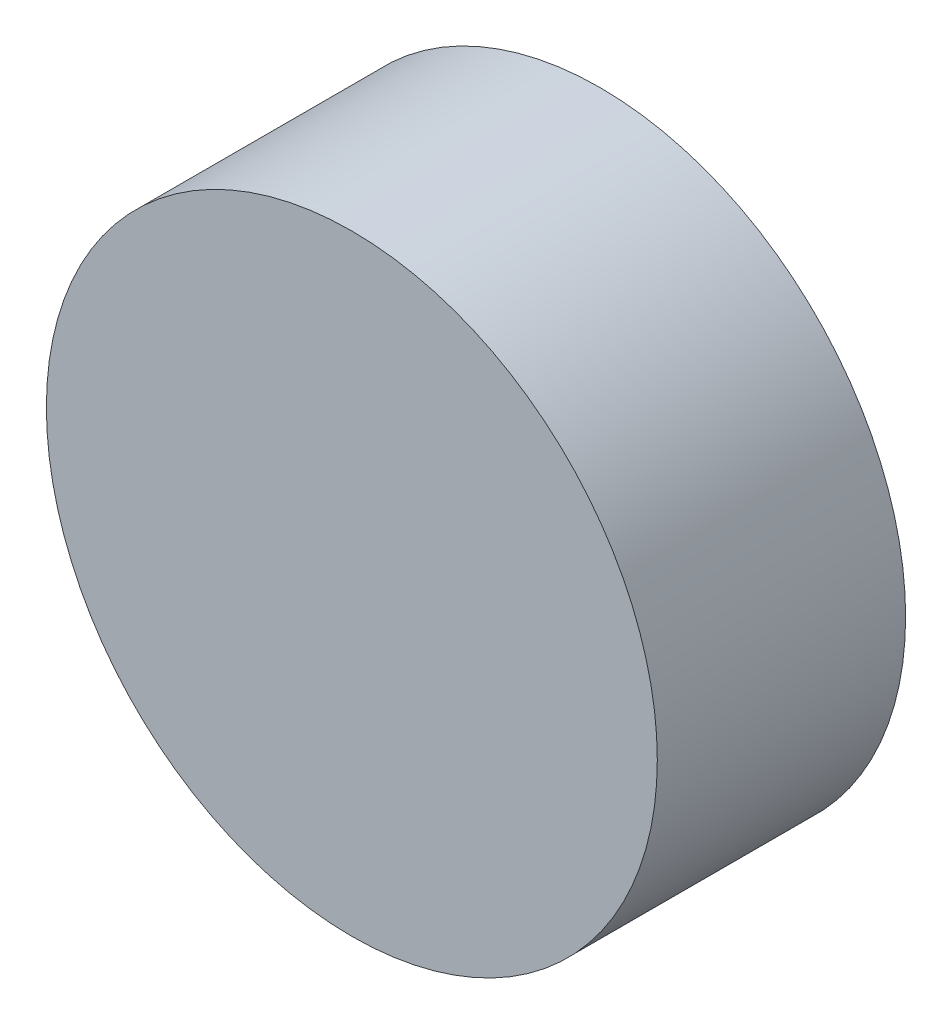
ISO-10303-21;
HEADER;
FILE_DESCRIPTION(('STEP AP214'),'2;1');
FILE_NAME('part.step','',(''),(''),'','','');
FILE_SCHEMA(('AUTOMOTIVE_DESIGN { 1 0 10303 214 1 1 1 1 }'));
ENDSEC;
DATA;
#1=APPLICATION_CONTEXT('core data for automotive mechanical design processes');
#2=APPLICATION_PROTOCOL_DEFINITION('international standard','automotive_design',2000,#1);
#3=PRODUCT_CONTEXT('',#1,'mechanical');
#4=PRODUCT('Part','Part','',(#3));
#5=PRODUCT_RELATED_PRODUCT_CATEGORY('part','',(#4));
#6=PRODUCT_DEFINITION_FORMATION('','',#4);
#7=PRODUCT_DEFINITION_CONTEXT('part definition',#1,'design');
#8=PRODUCT_DEFINITION('design','',#6,#7);
#9=PRODUCT_DEFINITION_SHAPE('','',#8);
#10=(LENGTH_UNIT() NAMED_UNIT(*) SI_UNIT(.MILLI.,.METRE.));
#11=(NAMED_UNIT(*) PLANE_ANGLE_UNIT() SI_UNIT($,.RADIAN.));
#12=(NAMED_UNIT(*) SI_UNIT($,.STERADIAN.) SOLID_ANGLE_UNIT());
#13=UNCERTAINTY_MEASURE_WITH_UNIT(LENGTH_MEASURE(1.E-05),#10,'distance_accuracy_value','');
#14=(GEOMETRIC_REPRESENTATION_CONTEXT(3) GLOBAL_UNCERTAINTY_ASSIGNED_CONTEXT((#13)) GLOBAL_UNIT_ASSIGNED_CONTEXT((#10,
#11,#12)) REPRESENTATION_CONTEXT('',''));
#15=CARTESIAN_POINT('',(0.,0.,0.));
#16=DIRECTION('',(0.,0.,1.));
#17=DIRECTION('',(1.,0.,0.));
#18=AXIS2_PLACEMENT_3D('',#15,#16,#17);
#19=CARTESIAN_POINT('',(0.,0.,-3.15));
#20=DIRECTION('',(0.,0.,1.));
#21=DIRECTION('',(1.,0.,0.));
#22=AXIS2_PLACEMENT_3D('',#19,#20,#21);
#23=CYLINDRICAL_SURFACE('',#22,3.875);
#24=CARTESIAN_POINT('',(0.,0.,-3.15));
#25=DIRECTION('',(0.,0.,1.));
#26=DIRECTION('',(1.,0.,0.));
#27=AXIS2_PLACEMENT_3D('',#24,#25,#26);
#28=CIRCLE('',#27,3.875);
#29=CARTESIAN_POINT('',(3.875,0.,-3.15));
#30=VERTEX_POINT('',#29);
#31=EDGE_CURVE('E10',#30,#30,#28,.T.);
#32=ORIENTED_EDGE('',*,*,#31,.T.);
#33=EDGE_LOOP('',(#32));
#34=FACE_BOUND('',#33,.T.);
#35=CARTESIAN_POINT('',(0.,0.,0.));
#36=DIRECTION('',(0.,0.,1.));
#37=DIRECTION('',(1.,0.,0.));
#38=AXIS2_PLACEMENT_3D('',#35,#36,#37);
#39=CIRCLE('',#38,3.875);
#40=CARTESIAN_POINT('',(3.875,0.,0.));
#41=VERTEX_POINT('',#40);
#42=EDGE_CURVE('E34',#41,#41,#39,.T.);
#43=ORIENTED_EDGE('',*,*,#42,.F.);
#44=EDGE_LOOP('',(#43));
#45=FACE_BOUND('',#44,.T.);
#46=ADVANCED_FACE('F31',(#34,#45),#23,.T.);
#47=CARTESIAN_POINT('',(0.,0.,-3.15));
#48=DIRECTION('',(0.,0.,1.));
#49=DIRECTION('',(1.,0.,0.));
#50=AXIS2_PLACEMENT_3D('',#47,#48,#49);
#51=PLANE('',#50);
#52=CARTESIAN_POINT('',(0.,0.,-3.15));
#53=DIRECTION('',(0.,0.,1.));
#54=DIRECTION('',(1.,0.,0.));
#55=AXIS2_PLACEMENT_3D('',#52,#53,#54);
#56=CIRCLE('',#55,2.425);
#57=CARTESIAN_POINT('',(2.425,0.,-3.15));
#58=VERTEX_POINT('',#57);
#59=EDGE_CURVE('E41',#58,#58,#56,.T.);
#60=ORIENTED_EDGE('',*,*,#59,.T.);
#61=EDGE_LOOP('',(#60));
#62=FACE_BOUND('',#61,.T.);
#63=ORIENTED_EDGE('',*,*,#31,.F.);
#64=EDGE_LOOP('',(#63));
#65=FACE_BOUND('',#64,.T.);
#66=ADVANCED_FACE('F62',(#62,#65),#51,.F.);
#67=CARTESIAN_POINT('',(0.,0.,0.));
#68=DIRECTION('',(0.,0.,1.));
#69=DIRECTION('',(1.,0.,0.));
#70=AXIS2_PLACEMENT_3D('',#67,#68,#69);
#71=PLANE('',#70);
#72=ORIENTED_EDGE('',*,*,#42,.T.);
#73=EDGE_LOOP('',(#72));
#74=FACE_BOUND('',#73,.T.);
#75=ADVANCED_FACE('F57',(#74),#71,.T.);
#76=CARTESIAN_POINT('',(0.,0.,-3.15));
#77=DIRECTION('',(0.,0.,1.));
#78=DIRECTION('',(1.,0.,0.));
#79=AXIS2_PLACEMENT_3D('',#76,#77,#78);
#80=CYLINDRICAL_SURFACE('',#79,2.425);
#81=ORIENTED_EDGE('',*,*,#59,.F.);
#82=EDGE_LOOP('',(#81));
#83=FACE_BOUND('',#82,.T.);
#84=CARTESIAN_POINT('',(0.,0.,-1.45));
#85=DIRECTION('',(0.,0.,1.));
#86=DIRECTION('',(1.,0.,0.));
#87=AXIS2_PLACEMENT_3D('',#84,#85,#86);
#88=CIRCLE('',#87,2.425);
#89=CARTESIAN_POINT('',(2.425,0.,-1.45));
#90=VERTEX_POINT('',#89);
#91=EDGE_CURVE('E45',#90,#90,#88,.T.);
#92=ORIENTED_EDGE('',*,*,#91,.T.);
#93=EDGE_LOOP('',(#92));
#94=FACE_BOUND('',#93,.T.);
#95=ADVANCED_FACE('F49',(#83,#94),#80,.F.);
#96=CARTESIAN_POINT('',(0.,0.,-1.45));
#97=DIRECTION('',(0.,0.,1.));
#98=DIRECTION('',(1.,0.,0.));
#99=AXIS2_PLACEMENT_3D('',#96,#97,#98);
#100=PLANE('',#99);
#101=ORIENTED_EDGE('',*,*,#91,.F.);
#102=EDGE_LOOP('',(#101));
#103=FACE_BOUND('',#102,.T.);
#104=ADVANCED_FACE('F51',(#103),#100,.F.);
#105=CLOSED_SHELL('',(#46,#66,#75,#95,#104));
#106=MANIFOLD_SOLID_BREP('B2',#105);
#107=ADVANCED_BREP_SHAPE_REPRESENTATION('',(#18,#106),#14);
#108=SHAPE_DEFINITION_REPRESENTATION(#9,#107);
ENDSEC;
END-ISO-10303-21;
